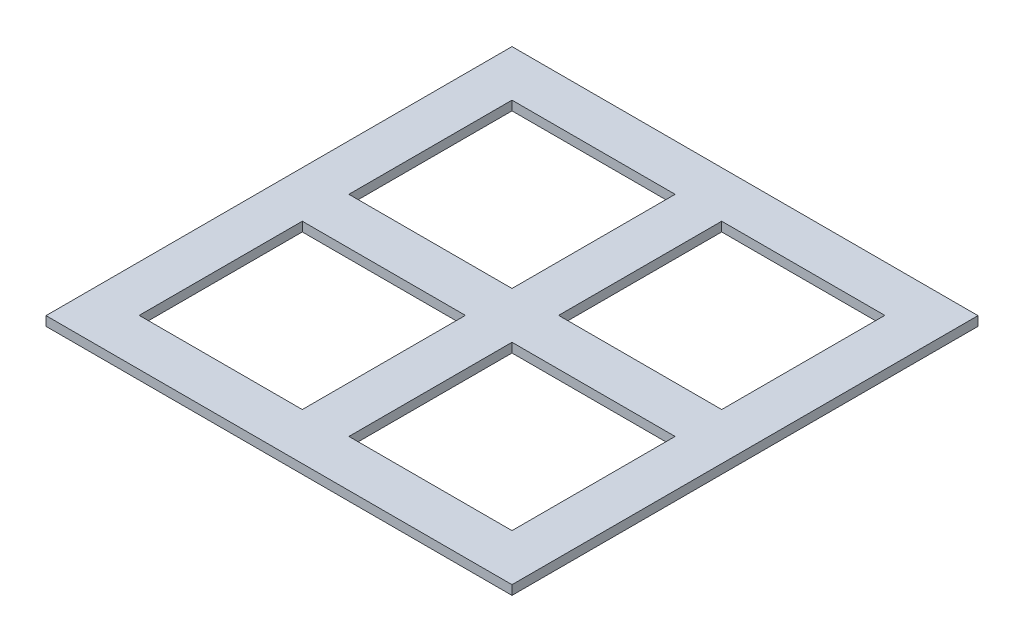
ISO-10303-21;
HEADER;
FILE_DESCRIPTION(('STEP AP214'),'2;1');
FILE_NAME('part.step','',(''),(''),'','','');
FILE_SCHEMA(('AUTOMOTIVE_DESIGN { 1 0 10303 214 1 1 1 1 }'));
ENDSEC;
DATA;
#1=APPLICATION_CONTEXT('core data for automotive mechanical design processes');
#2=APPLICATION_PROTOCOL_DEFINITION('international standard','automotive_design',2000,#1);
#3=PRODUCT_CONTEXT('',#1,'mechanical');
#4=PRODUCT('Part','Part','',(#3));
#5=PRODUCT_RELATED_PRODUCT_CATEGORY('part','',(#4));
#6=PRODUCT_DEFINITION_FORMATION('','',#4);
#7=PRODUCT_DEFINITION_CONTEXT('part definition',#1,'design');
#8=PRODUCT_DEFINITION('design','',#6,#7);
#9=PRODUCT_DEFINITION_SHAPE('','',#8);
#10=(LENGTH_UNIT() NAMED_UNIT(*) SI_UNIT(.MILLI.,.METRE.));
#11=(NAMED_UNIT(*) PLANE_ANGLE_UNIT() SI_UNIT($,.RADIAN.));
#12=(NAMED_UNIT(*) SI_UNIT($,.STERADIAN.) SOLID_ANGLE_UNIT());
#13=UNCERTAINTY_MEASURE_WITH_UNIT(LENGTH_MEASURE(1.E-05),#10,'distance_accuracy_value','');
#14=(GEOMETRIC_REPRESENTATION_CONTEXT(3) GLOBAL_UNCERTAINTY_ASSIGNED_CONTEXT((#13)) GLOBAL_UNIT_ASSIGNED_CONTEXT((#10,
#11,#12)) REPRESENTATION_CONTEXT('',''));
#15=CARTESIAN_POINT('',(0.,0.,0.));
#16=DIRECTION('',(0.,0.,1.));
#17=DIRECTION('',(1.,0.,0.));
#18=AXIS2_PLACEMENT_3D('',#15,#16,#17);
#19=CARTESIAN_POINT('',(0.,2.,-90.0468668693287));
#20=DIRECTION('',(0.,0.,1.));
#21=DIRECTION('',(1.,0.,0.));
#22=AXIS2_PLACEMENT_3D('',#19,#20,#21);
#23=PLANE('',#22);
#24=DIRECTION('',(-1.,0.,0.));
#25=VECTOR('',#24,1.);
#26=CARTESIAN_POINT('',(0.,0.,-90.0468668693287));
#27=LINE('',#26,#25);
#28=CARTESIAN_POINT('',(44.9531331306714,0.,-90.0468668693287));
#29=VERTEX_POINT('',#28);
#30=CARTESIAN_POINT('',(9.95313313067135,0.,-90.0468668693287));
#31=VERTEX_POINT('',#30);
#32=EDGE_CURVE('E292',#29,#31,#27,.T.);
#33=ORIENTED_EDGE('',*,*,#32,.F.);
#34=DIRECTION('',(0.,-1.,0.));
#35=VECTOR('',#34,1.);
#36=CARTESIAN_POINT('',(44.9531331306714,2.,-90.0468668693287));
#37=LINE('',#36,#35);
#38=CARTESIAN_POINT('',(44.9531331306714,2.,-90.0468668693287));
#39=VERTEX_POINT('',#38);
#40=EDGE_CURVE('E11',#39,#29,#37,.T.);
#41=ORIENTED_EDGE('',*,*,#40,.F.);
#42=DIRECTION('',(-1.,0.,0.));
#43=VECTOR('',#42,1.);
#44=CARTESIAN_POINT('',(0.,2.,-90.0468668693287));
#45=LINE('',#44,#43);
#46=CARTESIAN_POINT('',(9.95313313067135,2.,-90.0468668693287));
#47=VERTEX_POINT('',#46);
#48=EDGE_CURVE('E190',#39,#47,#45,.T.);
#49=ORIENTED_EDGE('',*,*,#48,.T.);
#50=DIRECTION('',(0.,-1.,0.));
#51=VECTOR('',#50,1.);
#52=CARTESIAN_POINT('',(9.95313313067135,2.,-90.0468668693287));
#53=LINE('',#52,#51);
#54=EDGE_CURVE('E52',#47,#31,#53,.T.);
#55=ORIENTED_EDGE('',*,*,#54,.T.);
#56=EDGE_LOOP('',(#33,#41,#49,#55));
#57=FACE_BOUND('',#56,.T.);
#58=ADVANCED_FACE('F33',(#57),#23,.T.);
#59=CARTESIAN_POINT('',(44.9531331306713,2.,0.));
#60=DIRECTION('',(1.,0.,0.));
#61=DIRECTION('',(0.,0.,-1.));
#62=AXIS2_PLACEMENT_3D('',#59,#60,#61);
#63=PLANE('',#62);
#64=DIRECTION('',(0.,0.,1.));
#65=VECTOR('',#64,1.);
#66=CARTESIAN_POINT('',(44.9531331306713,0.,0.));
#67=LINE('',#66,#65);
#68=CARTESIAN_POINT('',(44.9531331306713,0.,-55.0468668693287));
#69=VERTEX_POINT('',#68);
#70=EDGE_CURVE('E195',#29,#69,#67,.T.);
#71=ORIENTED_EDGE('',*,*,#70,.T.);
#72=DIRECTION('',(0.,-1.,0.));
#73=VECTOR('',#72,1.);
#74=CARTESIAN_POINT('',(44.9531331306713,2.,-55.0468668693287));
#75=LINE('',#74,#73);
#76=CARTESIAN_POINT('',(44.9531331306713,2.,-55.0468668693287));
#77=VERTEX_POINT('',#76);
#78=EDGE_CURVE('E43',#77,#69,#75,.T.);
#79=ORIENTED_EDGE('',*,*,#78,.F.);
#80=DIRECTION('',(0.,0.,1.));
#81=VECTOR('',#80,1.);
#82=CARTESIAN_POINT('',(44.9531331306713,2.,0.));
#83=LINE('',#82,#81);
#84=EDGE_CURVE('E185',#39,#77,#83,.T.);
#85=ORIENTED_EDGE('',*,*,#84,.F.);
#86=ORIENTED_EDGE('',*,*,#40,.T.);
#87=EDGE_LOOP('',(#71,#79,#85,#86));
#88=FACE_BOUND('',#87,.T.);
#89=ADVANCED_FACE('F193',(#88),#63,.F.);
#90=CARTESIAN_POINT('',(0.,2.,-55.0468668693286));
#91=DIRECTION('',(0.,0.,1.));
#92=DIRECTION('',(1.,0.,0.));
#93=AXIS2_PLACEMENT_3D('',#90,#91,#92);
#94=PLANE('',#93);
#95=DIRECTION('',(-1.,0.,0.));
#96=VECTOR('',#95,1.);
#97=CARTESIAN_POINT('',(0.,0.,-55.0468668693286));
#98=LINE('',#97,#96);
#99=CARTESIAN_POINT('',(9.95313313067135,0.,-55.0468668693287));
#100=VERTEX_POINT('',#99);
#101=EDGE_CURVE('E295',#69,#100,#98,.T.);
#102=ORIENTED_EDGE('',*,*,#101,.T.);
#103=DIRECTION('',(0.,-1.,0.));
#104=VECTOR('',#103,1.);
#105=CARTESIAN_POINT('',(9.95313313067135,2.,-55.0468668693287));
#106=LINE('',#105,#104);
#107=CARTESIAN_POINT('',(9.95313313067135,2.,-55.0468668693287));
#108=VERTEX_POINT('',#107);
#109=EDGE_CURVE('E114',#108,#100,#106,.T.);
#110=ORIENTED_EDGE('',*,*,#109,.F.);
#111=DIRECTION('',(-1.,0.,0.));
#112=VECTOR('',#111,1.);
#113=CARTESIAN_POINT('',(0.,2.,-55.0468668693286));
#114=LINE('',#113,#112);
#115=EDGE_CURVE('E177',#77,#108,#114,.T.);
#116=ORIENTED_EDGE('',*,*,#115,.F.);
#117=ORIENTED_EDGE('',*,*,#78,.T.);
#118=EDGE_LOOP('',(#102,#110,#116,#117));
#119=FACE_BOUND('',#118,.T.);
#120=ADVANCED_FACE('F179',(#119),#94,.F.);
#121=CARTESIAN_POINT('',(0.,2.,0.));
#122=DIRECTION('',(0.,0.,-1.));
#123=DIRECTION('',(-1.,0.,0.));
#124=AXIS2_PLACEMENT_3D('',#121,#122,#123);
#125=PLANE('',#124);
#126=DIRECTION('',(1.,0.,0.));
#127=VECTOR('',#126,1.);
#128=CARTESIAN_POINT('',(0.,0.,0.));
#129=LINE('',#128,#127);
#130=CARTESIAN_POINT('',(0.,0.,0.));
#131=VERTEX_POINT('',#130);
#132=CARTESIAN_POINT('',(100.,0.,0.));
#133=VERTEX_POINT('',#132);
#134=EDGE_CURVE('E280',#131,#133,#129,.T.);
#135=ORIENTED_EDGE('',*,*,#134,.T.);
#136=DIRECTION('',(0.,-1.,0.));
#137=VECTOR('',#136,1.);
#138=CARTESIAN_POINT('',(100.,2.,0.));
#139=LINE('',#138,#137);
#140=CARTESIAN_POINT('',(100.,2.,0.));
#141=VERTEX_POINT('',#140);
#142=EDGE_CURVE('E207',#141,#133,#139,.T.);
#143=ORIENTED_EDGE('',*,*,#142,.F.);
#144=DIRECTION('',(1.,0.,0.));
#145=VECTOR('',#144,1.);
#146=CARTESIAN_POINT('',(0.,2.,0.));
#147=LINE('',#146,#145);
#148=CARTESIAN_POINT('',(0.,2.,0.));
#149=VERTEX_POINT('',#148);
#150=EDGE_CURVE('E332',#149,#141,#147,.T.);
#151=ORIENTED_EDGE('',*,*,#150,.F.);
#152=DIRECTION('',(0.,-1.,0.));
#153=VECTOR('',#152,1.);
#154=CARTESIAN_POINT('',(0.,2.,0.));
#155=LINE('',#154,#153);
#156=EDGE_CURVE('E200',#149,#131,#155,.T.);
#157=ORIENTED_EDGE('',*,*,#156,.T.);
#158=EDGE_LOOP('',(#135,#143,#151,#157));
#159=FACE_BOUND('',#158,.T.);
#160=ADVANCED_FACE('F379',(#159),#125,.F.);
#161=CARTESIAN_POINT('',(100.,2.,0.));
#162=DIRECTION('',(-1.,0.,0.));
#163=DIRECTION('',(0.,0.,1.));
#164=AXIS2_PLACEMENT_3D('',#161,#162,#163);
#165=PLANE('',#164);
#166=DIRECTION('',(0.,0.,-1.));
#167=VECTOR('',#166,1.);
#168=CARTESIAN_POINT('',(100.,0.,0.));
#169=LINE('',#168,#167);
#170=CARTESIAN_POINT('',(100.,0.,-100.));
#171=VERTEX_POINT('',#170);
#172=EDGE_CURVE('E283',#133,#171,#169,.T.);
#173=ORIENTED_EDGE('',*,*,#172,.T.);
#174=DIRECTION('',(0.,-1.,0.));
#175=VECTOR('',#174,1.);
#176=CARTESIAN_POINT('',(100.,2.,-100.));
#177=LINE('',#176,#175);
#178=CARTESIAN_POINT('',(100.,2.,-100.));
#179=VERTEX_POINT('',#178);
#180=EDGE_CURVE('E205',#179,#171,#177,.T.);
#181=ORIENTED_EDGE('',*,*,#180,.F.);
#182=DIRECTION('',(0.,0.,-1.));
#183=VECTOR('',#182,1.);
#184=CARTESIAN_POINT('',(100.,2.,0.));
#185=LINE('',#184,#183);
#186=EDGE_CURVE('E335',#141,#179,#185,.T.);
#187=ORIENTED_EDGE('',*,*,#186,.F.);
#188=ORIENTED_EDGE('',*,*,#142,.T.);
#189=EDGE_LOOP('',(#173,#181,#187,#188));
#190=FACE_BOUND('',#189,.T.);
#191=ADVANCED_FACE('F375',(#190),#165,.F.);
#192=CARTESIAN_POINT('',(0.,2.,-100.));
#193=DIRECTION('',(0.,0.,-1.));
#194=DIRECTION('',(-1.,0.,0.));
#195=AXIS2_PLACEMENT_3D('',#192,#193,#194);
#196=PLANE('',#195);
#197=DIRECTION('',(1.,0.,0.));
#198=VECTOR('',#197,1.);
#199=CARTESIAN_POINT('',(0.,0.,-100.));
#200=LINE('',#199,#198);
#201=CARTESIAN_POINT('',(0.,0.,-100.));
#202=VERTEX_POINT('',#201);
#203=EDGE_CURVE('E286',#202,#171,#200,.T.);
#204=ORIENTED_EDGE('',*,*,#203,.F.);
#205=DIRECTION('',(0.,-1.,0.));
#206=VECTOR('',#205,1.);
#207=CARTESIAN_POINT('',(0.,2.,-100.));
#208=LINE('',#207,#206);
#209=CARTESIAN_POINT('',(0.,2.,-100.));
#210=VERTEX_POINT('',#209);
#211=EDGE_CURVE('E202',#210,#202,#208,.T.);
#212=ORIENTED_EDGE('',*,*,#211,.F.);
#213=DIRECTION('',(1.,0.,0.));
#214=VECTOR('',#213,1.);
#215=CARTESIAN_POINT('',(0.,2.,-100.));
#216=LINE('',#215,#214);
#217=EDGE_CURVE('E337',#210,#179,#216,.T.);
#218=ORIENTED_EDGE('',*,*,#217,.T.);
#219=ORIENTED_EDGE('',*,*,#180,.T.);
#220=EDGE_LOOP('',(#204,#212,#218,#219));
#221=FACE_BOUND('',#220,.T.);
#222=ADVANCED_FACE('F371',(#221),#196,.T.);
#223=CARTESIAN_POINT('',(89.9531331306713,2.,0.));
#224=DIRECTION('',(-1.,0.,0.));
#225=DIRECTION('',(0.,0.,1.));
#226=AXIS2_PLACEMENT_3D('',#223,#224,#225);
#227=PLANE('',#226);
#228=DIRECTION('',(0.,0.,-1.));
#229=VECTOR('',#228,1.);
#230=CARTESIAN_POINT('',(89.9531331306713,0.,0.));
#231=LINE('',#230,#229);
#232=CARTESIAN_POINT('',(89.9531331306713,0.,-55.0468668693287));
#233=VERTEX_POINT('',#232);
#234=CARTESIAN_POINT('',(89.9531331306713,0.,-90.0468668693287));
#235=VERTEX_POINT('',#234);
#236=EDGE_CURVE('E268',#233,#235,#231,.T.);
#237=ORIENTED_EDGE('',*,*,#236,.F.);
#238=DIRECTION('',(0.,-1.,0.));
#239=VECTOR('',#238,1.);
#240=CARTESIAN_POINT('',(89.9531331306713,2.,-55.0468668693287));
#241=LINE('',#240,#239);
#242=CARTESIAN_POINT('',(89.9531331306713,2.,-55.0468668693287));
#243=VERTEX_POINT('',#242);
#244=EDGE_CURVE('E203',#243,#233,#241,.T.);
#245=ORIENTED_EDGE('',*,*,#244,.F.);
#246=DIRECTION('',(0.,0.,-1.));
#247=VECTOR('',#246,1.);
#248=CARTESIAN_POINT('',(89.9531331306713,2.,0.));
#249=LINE('',#248,#247);
#250=CARTESIAN_POINT('',(89.9531331306713,2.,-90.0468668693287));
#251=VERTEX_POINT('',#250);
#252=EDGE_CURVE('E321',#243,#251,#249,.T.);
#253=ORIENTED_EDGE('',*,*,#252,.T.);
#254=DIRECTION('',(0.,-1.,0.));
#255=VECTOR('',#254,1.);
#256=CARTESIAN_POINT('',(89.9531331306713,2.,-90.0468668693287));
#257=LINE('',#256,#255);
#258=EDGE_CURVE('E210',#251,#235,#257,.T.);
#259=ORIENTED_EDGE('',*,*,#258,.T.);
#260=EDGE_LOOP('',(#237,#245,#253,#259));
#261=FACE_BOUND('',#260,.T.);
#262=ADVANCED_FACE('F374',(#261),#227,.T.);
#263=CARTESIAN_POINT('',(0.,2.,-55.0468668693287));
#264=DIRECTION('',(0.,0.,1.));
#265=DIRECTION('',(1.,0.,0.));
#266=AXIS2_PLACEMENT_3D('',#263,#264,#265);
#267=PLANE('',#266);
#268=DIRECTION('',(-1.,0.,0.));
#269=VECTOR('',#268,1.);
#270=CARTESIAN_POINT('',(0.,0.,-55.0468668693287));
#271=LINE('',#270,#269);
#272=CARTESIAN_POINT('',(54.9531331306713,0.,-55.0468668693287));
#273=VERTEX_POINT('',#272);
#274=EDGE_CURVE('E271',#233,#273,#271,.T.);
#275=ORIENTED_EDGE('',*,*,#274,.T.);
#276=DIRECTION('',(0.,-1.,0.));
#277=VECTOR('',#276,1.);
#278=CARTESIAN_POINT('',(54.9531331306713,2.,-55.0468668693287));
#279=LINE('',#278,#277);
#280=CARTESIAN_POINT('',(54.9531331306713,2.,-55.0468668693287));
#281=VERTEX_POINT('',#280);
#282=EDGE_CURVE('E215',#281,#273,#279,.T.);
#283=ORIENTED_EDGE('',*,*,#282,.F.);
#284=DIRECTION('',(-1.,0.,0.));
#285=VECTOR('',#284,1.);
#286=CARTESIAN_POINT('',(0.,2.,-55.0468668693287));
#287=LINE('',#286,#285);
#288=EDGE_CURVE('E324',#243,#281,#287,.T.);
#289=ORIENTED_EDGE('',*,*,#288,.F.);
#290=ORIENTED_EDGE('',*,*,#244,.T.);
#291=EDGE_LOOP('',(#275,#283,#289,#290));
#292=FACE_BOUND('',#291,.T.);
#293=ADVANCED_FACE('F391',(#292),#267,.F.);
#294=CARTESIAN_POINT('',(54.9531331306713,2.,0.));
#295=DIRECTION('',(1.,0.,0.));
#296=DIRECTION('',(0.,0.,-1.));
#297=AXIS2_PLACEMENT_3D('',#294,#295,#296);
#298=PLANE('',#297);
#299=DIRECTION('',(0.,0.,1.));
#300=VECTOR('',#299,1.);
#301=CARTESIAN_POINT('',(54.9531331306713,0.,0.));
#302=LINE('',#301,#300);
#303=CARTESIAN_POINT('',(54.9531331306713,0.,-90.0468668693287));
#304=VERTEX_POINT('',#303);
#305=EDGE_CURVE('E274',#304,#273,#302,.T.);
#306=ORIENTED_EDGE('',*,*,#305,.F.);
#307=DIRECTION('',(0.,-1.,0.));
#308=VECTOR('',#307,1.);
#309=CARTESIAN_POINT('',(54.9531331306713,2.,-90.0468668693287));
#310=LINE('',#309,#308);
#311=CARTESIAN_POINT('',(54.9531331306713,2.,-90.0468668693287));
#312=VERTEX_POINT('',#311);
#313=EDGE_CURVE('E212',#312,#304,#310,.T.);
#314=ORIENTED_EDGE('',*,*,#313,.F.);
#315=DIRECTION('',(0.,0.,1.));
#316=VECTOR('',#315,1.);
#317=CARTESIAN_POINT('',(54.9531331306713,2.,0.));
#318=LINE('',#317,#316);
#319=EDGE_CURVE('E326',#312,#281,#318,.T.);
#320=ORIENTED_EDGE('',*,*,#319,.T.);
#321=ORIENTED_EDGE('',*,*,#282,.T.);
#322=EDGE_LOOP('',(#306,#314,#320,#321));
#323=FACE_BOUND('',#322,.T.);
#324=ADVANCED_FACE('F387',(#323),#298,.T.);
#325=CARTESIAN_POINT('',(0.,2.,-45.0468668693287));
#326=DIRECTION('',(0.,0.,1.));
#327=DIRECTION('',(1.,0.,0.));
#328=AXIS2_PLACEMENT_3D('',#325,#326,#327);
#329=PLANE('',#328);
#330=DIRECTION('',(-1.,0.,0.));
#331=VECTOR('',#330,1.);
#332=CARTESIAN_POINT('',(0.,0.,-45.0468668693287));
#333=LINE('',#332,#331);
#334=CARTESIAN_POINT('',(44.9531331306714,0.,-45.0468668693287));
#335=VERTEX_POINT('',#334);
#336=CARTESIAN_POINT('',(9.95313313067135,0.,-45.0468668693287));
#337=VERTEX_POINT('',#336);
#338=EDGE_CURVE('E256',#335,#337,#333,.T.);
#339=ORIENTED_EDGE('',*,*,#338,.F.);
#340=DIRECTION('',(0.,-1.,0.));
#341=VECTOR('',#340,1.);
#342=CARTESIAN_POINT('',(44.9531331306714,2.,-45.0468668693287));
#343=LINE('',#342,#341);
#344=CARTESIAN_POINT('',(44.9531331306714,2.,-45.0468668693287));
#345=VERTEX_POINT('',#344);
#346=EDGE_CURVE('E213',#345,#335,#343,.T.);
#347=ORIENTED_EDGE('',*,*,#346,.F.);
#348=DIRECTION('',(-1.,0.,0.));
#349=VECTOR('',#348,1.);
#350=CARTESIAN_POINT('',(0.,2.,-45.0468668693287));
#351=LINE('',#350,#349);
#352=CARTESIAN_POINT('',(9.95313313067135,2.,-45.0468668693287));
#353=VERTEX_POINT('',#352);
#354=EDGE_CURVE('E310',#345,#353,#351,.T.);
#355=ORIENTED_EDGE('',*,*,#354,.T.);
#356=DIRECTION('',(0.,-1.,0.));
#357=VECTOR('',#356,1.);
#358=CARTESIAN_POINT('',(9.95313313067135,2.,-45.0468668693287));
#359=LINE('',#358,#357);
#360=EDGE_CURVE('E218',#353,#337,#359,.T.);
#361=ORIENTED_EDGE('',*,*,#360,.T.);
#362=EDGE_LOOP('',(#339,#347,#355,#361));
#363=FACE_BOUND('',#362,.T.);
#364=ADVANCED_FACE('F390',(#363),#329,.T.);
#365=CARTESIAN_POINT('',(44.9531331306714,2.,0.));
#366=DIRECTION('',(1.,0.,0.));
#367=DIRECTION('',(0.,0.,-1.));
#368=AXIS2_PLACEMENT_3D('',#365,#366,#367);
#369=PLANE('',#368);
#370=DIRECTION('',(0.,0.,1.));
#371=VECTOR('',#370,1.);
#372=CARTESIAN_POINT('',(44.9531331306714,0.,0.));
#373=LINE('',#372,#371);
#374=CARTESIAN_POINT('',(44.9531331306714,0.,-10.0468668693287));
#375=VERTEX_POINT('',#374);
#376=EDGE_CURVE('E259',#335,#375,#373,.T.);
#377=ORIENTED_EDGE('',*,*,#376,.T.);
#378=DIRECTION('',(0.,-1.,0.));
#379=VECTOR('',#378,1.);
#380=CARTESIAN_POINT('',(44.9531331306714,2.,-10.0468668693287));
#381=LINE('',#380,#379);
#382=CARTESIAN_POINT('',(44.9531331306714,2.,-10.0468668693287));
#383=VERTEX_POINT('',#382);
#384=EDGE_CURVE('E222',#383,#375,#381,.T.);
#385=ORIENTED_EDGE('',*,*,#384,.F.);
#386=DIRECTION('',(0.,0.,1.));
#387=VECTOR('',#386,1.);
#388=CARTESIAN_POINT('',(44.9531331306714,2.,0.));
#389=LINE('',#388,#387);
#390=EDGE_CURVE('E313',#345,#383,#389,.T.);
#391=ORIENTED_EDGE('',*,*,#390,.F.);
#392=ORIENTED_EDGE('',*,*,#346,.T.);
#393=EDGE_LOOP('',(#377,#385,#391,#392));
#394=FACE_BOUND('',#393,.T.);
#395=ADVANCED_FACE('F405',(#394),#369,.F.);
#396=CARTESIAN_POINT('',(0.,2.,-10.0468668693287));
#397=DIRECTION('',(0.,0.,-1.));
#398=DIRECTION('',(-1.,0.,0.));
#399=AXIS2_PLACEMENT_3D('',#396,#397,#398);
#400=PLANE('',#399);
#401=DIRECTION('',(1.,0.,0.));
#402=VECTOR('',#401,1.);
#403=CARTESIAN_POINT('',(0.,0.,-10.0468668693287));
#404=LINE('',#403,#402);
#405=CARTESIAN_POINT('',(9.95313313067136,0.,-10.0468668693287));
#406=VERTEX_POINT('',#405);
#407=EDGE_CURVE('E262',#406,#375,#404,.T.);
#408=ORIENTED_EDGE('',*,*,#407,.F.);
#409=DIRECTION('',(0.,-1.,0.));
#410=VECTOR('',#409,1.);
#411=CARTESIAN_POINT('',(9.95313313067136,2.,-10.0468668693287));
#412=LINE('',#411,#410);
#413=CARTESIAN_POINT('',(9.95313313067136,2.,-10.0468668693287));
#414=VERTEX_POINT('',#413);
#415=EDGE_CURVE('E220',#414,#406,#412,.T.);
#416=ORIENTED_EDGE('',*,*,#415,.F.);
#417=DIRECTION('',(1.,0.,0.));
#418=VECTOR('',#417,1.);
#419=CARTESIAN_POINT('',(0.,2.,-10.0468668693287));
#420=LINE('',#419,#418);
#421=EDGE_CURVE('E315',#414,#383,#420,.T.);
#422=ORIENTED_EDGE('',*,*,#421,.T.);
#423=ORIENTED_EDGE('',*,*,#384,.T.);
#424=EDGE_LOOP('',(#408,#416,#422,#423));
#425=FACE_BOUND('',#424,.T.);
#426=ADVANCED_FACE('F402',(#425),#400,.T.);
#427=CARTESIAN_POINT('',(0.,2.,-10.0468668693287));
#428=DIRECTION('',(0.,0.,-1.));
#429=DIRECTION('',(-1.,0.,0.));
#430=AXIS2_PLACEMENT_3D('',#427,#428,#429);
#431=PLANE('',#430);
#432=DIRECTION('',(1.,0.,0.));
#433=VECTOR('',#432,1.);
#434=CARTESIAN_POINT('',(0.,0.,-10.0468668693287));
#435=LINE('',#434,#433);
#436=CARTESIAN_POINT('',(54.9531331306713,0.,-10.0468668693287));
#437=VERTEX_POINT('',#436);
#438=CARTESIAN_POINT('',(89.9531331306713,0.,-10.0468668693287));
#439=VERTEX_POINT('',#438);
#440=EDGE_CURVE('E242',#437,#439,#435,.T.);
#441=ORIENTED_EDGE('',*,*,#440,.F.);
#442=DIRECTION('',(0.,-1.,0.));
#443=VECTOR('',#442,1.);
#444=CARTESIAN_POINT('',(54.9531331306713,2.,-10.0468668693287));
#445=LINE('',#444,#443);
#446=CARTESIAN_POINT('',(54.9531331306713,2.,-10.0468668693287));
#447=VERTEX_POINT('',#446);
#448=EDGE_CURVE('E37',#447,#437,#445,.T.);
#449=ORIENTED_EDGE('',*,*,#448,.F.);
#450=DIRECTION('',(1.,0.,0.));
#451=VECTOR('',#450,1.);
#452=CARTESIAN_POINT('',(0.,2.,-10.0468668693287));
#453=LINE('',#452,#451);
#454=CARTESIAN_POINT('',(89.9531331306713,2.,-10.0468668693287));
#455=VERTEX_POINT('',#454);
#456=EDGE_CURVE('E299',#447,#455,#453,.T.);
#457=ORIENTED_EDGE('',*,*,#456,.T.);
#458=DIRECTION('',(0.,-1.,0.));
#459=VECTOR('',#458,1.);
#460=CARTESIAN_POINT('',(89.9531331306713,2.,-10.0468668693287));
#461=LINE('',#460,#459);
#462=EDGE_CURVE('E225',#455,#439,#461,.T.);
#463=ORIENTED_EDGE('',*,*,#462,.T.);
#464=EDGE_LOOP('',(#441,#449,#457,#463));
#465=FACE_BOUND('',#464,.T.);
#466=ADVANCED_FACE('F35',(#465),#431,.T.);
#467=CARTESIAN_POINT('',(54.9531331306713,2.,0.));
#468=DIRECTION('',(1.,0.,0.));
#469=DIRECTION('',(0.,0.,-1.));
#470=AXIS2_PLACEMENT_3D('',#467,#468,#469);
#471=PLANE('',#470);
#472=DIRECTION('',(0.,0.,1.));
#473=VECTOR('',#472,1.);
#474=CARTESIAN_POINT('',(54.9531331306713,0.,0.));
#475=LINE('',#474,#473);
#476=CARTESIAN_POINT('',(54.9531331306713,0.,-45.0468668693287));
#477=VERTEX_POINT('',#476);
#478=EDGE_CURVE('E237',#477,#437,#475,.T.);
#479=ORIENTED_EDGE('',*,*,#478,.F.);
#480=DIRECTION('',(0.,-1.,0.));
#481=VECTOR('',#480,1.);
#482=CARTESIAN_POINT('',(54.9531331306713,2.,-45.0468668693287));
#483=LINE('',#482,#481);
#484=CARTESIAN_POINT('',(54.9531331306713,2.,-45.0468668693287));
#485=VERTEX_POINT('',#484);
#486=EDGE_CURVE('E228',#485,#477,#483,.T.);
#487=ORIENTED_EDGE('',*,*,#486,.F.);
#488=DIRECTION('',(0.,0.,1.));
#489=VECTOR('',#488,1.);
#490=CARTESIAN_POINT('',(54.9531331306713,2.,0.));
#491=LINE('',#490,#489);
#492=EDGE_CURVE('E240',#485,#447,#491,.T.);
#493=ORIENTED_EDGE('',*,*,#492,.T.);
#494=ORIENTED_EDGE('',*,*,#448,.T.);
#495=EDGE_LOOP('',(#479,#487,#493,#494));
#496=FACE_BOUND('',#495,.T.);
#497=ADVANCED_FACE('F235',(#496),#471,.T.);
#498=CARTESIAN_POINT('',(0.,2.,-45.0468668693287));
#499=DIRECTION('',(0.,0.,1.));
#500=DIRECTION('',(1.,0.,0.));
#501=AXIS2_PLACEMENT_3D('',#498,#499,#500);
#502=PLANE('',#501);
#503=DIRECTION('',(-1.,0.,0.));
#504=VECTOR('',#503,1.);
#505=CARTESIAN_POINT('',(0.,0.,-45.0468668693287));
#506=LINE('',#505,#504);
#507=CARTESIAN_POINT('',(89.9531331306713,0.,-45.0468668693287));
#508=VERTEX_POINT('',#507);
#509=EDGE_CURVE('E249',#508,#477,#506,.T.);
#510=ORIENTED_EDGE('',*,*,#509,.F.);
#511=DIRECTION('',(0.,-1.,0.));
#512=VECTOR('',#511,1.);
#513=CARTESIAN_POINT('',(89.9531331306713,2.,-45.0468668693287));
#514=LINE('',#513,#512);
#515=CARTESIAN_POINT('',(89.9531331306713,2.,-45.0468668693287));
#516=VERTEX_POINT('',#515);
#517=EDGE_CURVE('E227',#516,#508,#514,.T.);
#518=ORIENTED_EDGE('',*,*,#517,.F.);
#519=DIRECTION('',(-1.,0.,0.));
#520=VECTOR('',#519,1.);
#521=CARTESIAN_POINT('',(0.,2.,-45.0468668693287));
#522=LINE('',#521,#520);
#523=EDGE_CURVE('E303',#516,#485,#522,.T.);
#524=ORIENTED_EDGE('',*,*,#523,.T.);
#525=ORIENTED_EDGE('',*,*,#486,.T.);
#526=EDGE_LOOP('',(#510,#518,#524,#525));
#527=FACE_BOUND('',#526,.T.);
#528=ADVANCED_FACE('F369',(#527),#502,.T.);
#529=CARTESIAN_POINT('',(0.,2.,0.));
#530=DIRECTION('',(-1.,0.,0.));
#531=DIRECTION('',(0.,0.,1.));
#532=AXIS2_PLACEMENT_3D('',#529,#530,#531);
#533=PLANE('',#532);
#534=DIRECTION('',(0.,0.,-1.));
#535=VECTOR('',#534,1.);
#536=CARTESIAN_POINT('',(0.,0.,0.));
#537=LINE('',#536,#535);
#538=EDGE_CURVE('E289',#131,#202,#537,.T.);
#539=ORIENTED_EDGE('',*,*,#538,.F.);
#540=ORIENTED_EDGE('',*,*,#156,.F.);
#541=DIRECTION('',(0.,0.,-1.));
#542=VECTOR('',#541,1.);
#543=CARTESIAN_POINT('',(0.,2.,0.));
#544=LINE('',#543,#542);
#545=EDGE_CURVE('E340',#149,#210,#544,.T.);
#546=ORIENTED_EDGE('',*,*,#545,.T.);
#547=ORIENTED_EDGE('',*,*,#211,.T.);
#548=EDGE_LOOP('',(#539,#540,#546,#547));
#549=FACE_BOUND('',#548,.T.);
#550=ADVANCED_FACE('F365',(#549),#533,.T.);
#551=CARTESIAN_POINT('',(0.,2.,-90.0468668693287));
#552=DIRECTION('',(0.,0.,1.));
#553=DIRECTION('',(1.,0.,0.));
#554=AXIS2_PLACEMENT_3D('',#551,#552,#553);
#555=PLANE('',#554);
#556=DIRECTION('',(-1.,0.,0.));
#557=VECTOR('',#556,1.);
#558=CARTESIAN_POINT('',(0.,0.,-90.0468668693287));
#559=LINE('',#558,#557);
#560=EDGE_CURVE('E277',#235,#304,#559,.T.);
#561=ORIENTED_EDGE('',*,*,#560,.F.);
#562=ORIENTED_EDGE('',*,*,#258,.F.);
#563=DIRECTION('',(-1.,0.,0.));
#564=VECTOR('',#563,1.);
#565=CARTESIAN_POINT('',(0.,2.,-90.0468668693287));
#566=LINE('',#565,#564);
#567=EDGE_CURVE('E329',#251,#312,#566,.T.);
#568=ORIENTED_EDGE('',*,*,#567,.T.);
#569=ORIENTED_EDGE('',*,*,#313,.T.);
#570=EDGE_LOOP('',(#561,#562,#568,#569));
#571=FACE_BOUND('',#570,.T.);
#572=ADVANCED_FACE('F368',(#571),#555,.T.);
#573=CARTESIAN_POINT('',(9.95313313067136,2.,0.));
#574=DIRECTION('',(1.,0.,0.));
#575=DIRECTION('',(0.,0.,-1.));
#576=AXIS2_PLACEMENT_3D('',#573,#574,#575);
#577=PLANE('',#576);
#578=DIRECTION('',(0.,0.,1.));
#579=VECTOR('',#578,1.);
#580=CARTESIAN_POINT('',(9.95313313067136,0.,0.));
#581=LINE('',#580,#579);
#582=EDGE_CURVE('E265',#337,#406,#581,.T.);
#583=ORIENTED_EDGE('',*,*,#582,.F.);
#584=ORIENTED_EDGE('',*,*,#360,.F.);
#585=DIRECTION('',(0.,0.,1.));
#586=VECTOR('',#585,1.);
#587=CARTESIAN_POINT('',(9.95313313067136,2.,0.));
#588=LINE('',#587,#586);
#589=EDGE_CURVE('E318',#353,#414,#588,.T.);
#590=ORIENTED_EDGE('',*,*,#589,.T.);
#591=ORIENTED_EDGE('',*,*,#415,.T.);
#592=EDGE_LOOP('',(#583,#584,#590,#591));
#593=FACE_BOUND('',#592,.T.);
#594=ADVANCED_FACE('F353',(#593),#577,.T.);
#595=CARTESIAN_POINT('',(89.9531331306713,2.,0.));
#596=DIRECTION('',(-1.,0.,0.));
#597=DIRECTION('',(0.,0.,1.));
#598=AXIS2_PLACEMENT_3D('',#595,#596,#597);
#599=PLANE('',#598);
#600=DIRECTION('',(0.,0.,-1.));
#601=VECTOR('',#600,1.);
#602=CARTESIAN_POINT('',(89.9531331306713,0.,0.));
#603=LINE('',#602,#601);
#604=EDGE_CURVE('E251',#439,#508,#603,.T.);
#605=ORIENTED_EDGE('',*,*,#604,.F.);
#606=ORIENTED_EDGE('',*,*,#462,.F.);
#607=DIRECTION('',(0.,0.,-1.));
#608=VECTOR('',#607,1.);
#609=CARTESIAN_POINT('',(89.9531331306713,2.,0.));
#610=LINE('',#609,#608);
#611=EDGE_CURVE('E307',#455,#516,#610,.T.);
#612=ORIENTED_EDGE('',*,*,#611,.T.);
#613=ORIENTED_EDGE('',*,*,#517,.T.);
#614=EDGE_LOOP('',(#605,#606,#612,#613));
#615=FACE_BOUND('',#614,.T.);
#616=ADVANCED_FACE('F345',(#615),#599,.T.);
#617=CARTESIAN_POINT('',(9.95313313067135,2.,0.));
#618=DIRECTION('',(1.,0.,0.));
#619=DIRECTION('',(0.,0.,-1.));
#620=AXIS2_PLACEMENT_3D('',#617,#618,#619);
#621=PLANE('',#620);
#622=DIRECTION('',(0.,0.,1.));
#623=VECTOR('',#622,1.);
#624=CARTESIAN_POINT('',(9.95313313067135,0.,0.));
#625=LINE('',#624,#623);
#626=EDGE_CURVE('E297',#31,#100,#625,.T.);
#627=ORIENTED_EDGE('',*,*,#626,.F.);
#628=ORIENTED_EDGE('',*,*,#54,.F.);
#629=DIRECTION('',(0.,0.,1.));
#630=VECTOR('',#629,1.);
#631=CARTESIAN_POINT('',(9.95313313067135,2.,0.));
#632=LINE('',#631,#630);
#633=EDGE_CURVE('E184',#47,#108,#632,.T.);
#634=ORIENTED_EDGE('',*,*,#633,.T.);
#635=ORIENTED_EDGE('',*,*,#109,.T.);
#636=EDGE_LOOP('',(#627,#628,#634,#635));
#637=FACE_BOUND('',#636,.T.);
#638=ADVANCED_FACE('F343',(#637),#621,.T.);
#639=CARTESIAN_POINT('',(0.,2.,0.));
#640=DIRECTION('',(0.,1.,0.));
#641=DIRECTION('',(0.,0.,1.));
#642=AXIS2_PLACEMENT_3D('',#639,#640,#641);
#643=PLANE('',#642);
#644=ORIENTED_EDGE('',*,*,#456,.F.);
#645=ORIENTED_EDGE('',*,*,#492,.F.);
#646=ORIENTED_EDGE('',*,*,#523,.F.);
#647=ORIENTED_EDGE('',*,*,#611,.F.);
#648=EDGE_LOOP('',(#644,#645,#646,#647));
#649=FACE_BOUND('',#648,.T.);
#650=ORIENTED_EDGE('',*,*,#354,.F.);
#651=ORIENTED_EDGE('',*,*,#390,.T.);
#652=ORIENTED_EDGE('',*,*,#421,.F.);
#653=ORIENTED_EDGE('',*,*,#589,.F.);
#654=EDGE_LOOP('',(#650,#651,#652,#653));
#655=FACE_BOUND('',#654,.T.);
#656=ORIENTED_EDGE('',*,*,#252,.F.);
#657=ORIENTED_EDGE('',*,*,#288,.T.);
#658=ORIENTED_EDGE('',*,*,#319,.F.);
#659=ORIENTED_EDGE('',*,*,#567,.F.);
#660=EDGE_LOOP('',(#656,#657,#658,#659));
#661=FACE_BOUND('',#660,.T.);
#662=ORIENTED_EDGE('',*,*,#150,.T.);
#663=ORIENTED_EDGE('',*,*,#186,.T.);
#664=ORIENTED_EDGE('',*,*,#217,.F.);
#665=ORIENTED_EDGE('',*,*,#545,.F.);
#666=EDGE_LOOP('',(#662,#663,#664,#665));
#667=FACE_BOUND('',#666,.T.);
#668=ORIENTED_EDGE('',*,*,#48,.F.);
#669=ORIENTED_EDGE('',*,*,#84,.T.);
#670=ORIENTED_EDGE('',*,*,#115,.T.);
#671=ORIENTED_EDGE('',*,*,#633,.F.);
#672=EDGE_LOOP('',(#668,#669,#670,#671));
#673=FACE_BOUND('',#672,.T.);
#674=ADVANCED_FACE('F189',(#649,#655,#661,#667,#673),#643,.T.);
#675=CARTESIAN_POINT('',(0.,0.,0.));
#676=DIRECTION('',(0.,1.,0.));
#677=DIRECTION('',(0.,0.,1.));
#678=AXIS2_PLACEMENT_3D('',#675,#676,#677);
#679=PLANE('',#678);
#680=ORIENTED_EDGE('',*,*,#440,.T.);
#681=ORIENTED_EDGE('',*,*,#604,.T.);
#682=ORIENTED_EDGE('',*,*,#509,.T.);
#683=ORIENTED_EDGE('',*,*,#478,.T.);
#684=EDGE_LOOP('',(#680,#681,#682,#683));
#685=FACE_BOUND('',#684,.T.);
#686=ORIENTED_EDGE('',*,*,#338,.T.);
#687=ORIENTED_EDGE('',*,*,#582,.T.);
#688=ORIENTED_EDGE('',*,*,#407,.T.);
#689=ORIENTED_EDGE('',*,*,#376,.F.);
#690=EDGE_LOOP('',(#686,#687,#688,#689));
#691=FACE_BOUND('',#690,.T.);
#692=ORIENTED_EDGE('',*,*,#236,.T.);
#693=ORIENTED_EDGE('',*,*,#560,.T.);
#694=ORIENTED_EDGE('',*,*,#305,.T.);
#695=ORIENTED_EDGE('',*,*,#274,.F.);
#696=EDGE_LOOP('',(#692,#693,#694,#695));
#697=FACE_BOUND('',#696,.T.);
#698=ORIENTED_EDGE('',*,*,#134,.F.);
#699=ORIENTED_EDGE('',*,*,#538,.T.);
#700=ORIENTED_EDGE('',*,*,#203,.T.);
#701=ORIENTED_EDGE('',*,*,#172,.F.);
#702=EDGE_LOOP('',(#698,#699,#700,#701));
#703=FACE_BOUND('',#702,.T.);
#704=ORIENTED_EDGE('',*,*,#32,.T.);
#705=ORIENTED_EDGE('',*,*,#626,.T.);
#706=ORIENTED_EDGE('',*,*,#101,.F.);
#707=ORIENTED_EDGE('',*,*,#70,.F.);
#708=EDGE_LOOP('',(#704,#705,#706,#707));
#709=FACE_BOUND('',#708,.T.);
#710=ADVANCED_FACE('F247',(#685,#691,#697,#703,#709),#679,.F.);
#711=CLOSED_SHELL('',(#58,#89,#120,#160,#191,#222,#262,#293,#324,#364,#395,#426,#466,#497,#528,
#550,#572,#594,#616,#638,#674,#710));
#712=MANIFOLD_SOLID_BREP('B2',#711);
#713=ADVANCED_BREP_SHAPE_REPRESENTATION('',(#18,#712),#14);
#714=SHAPE_DEFINITION_REPRESENTATION(#9,#713);
ENDSEC;
END-ISO-10303-21;
